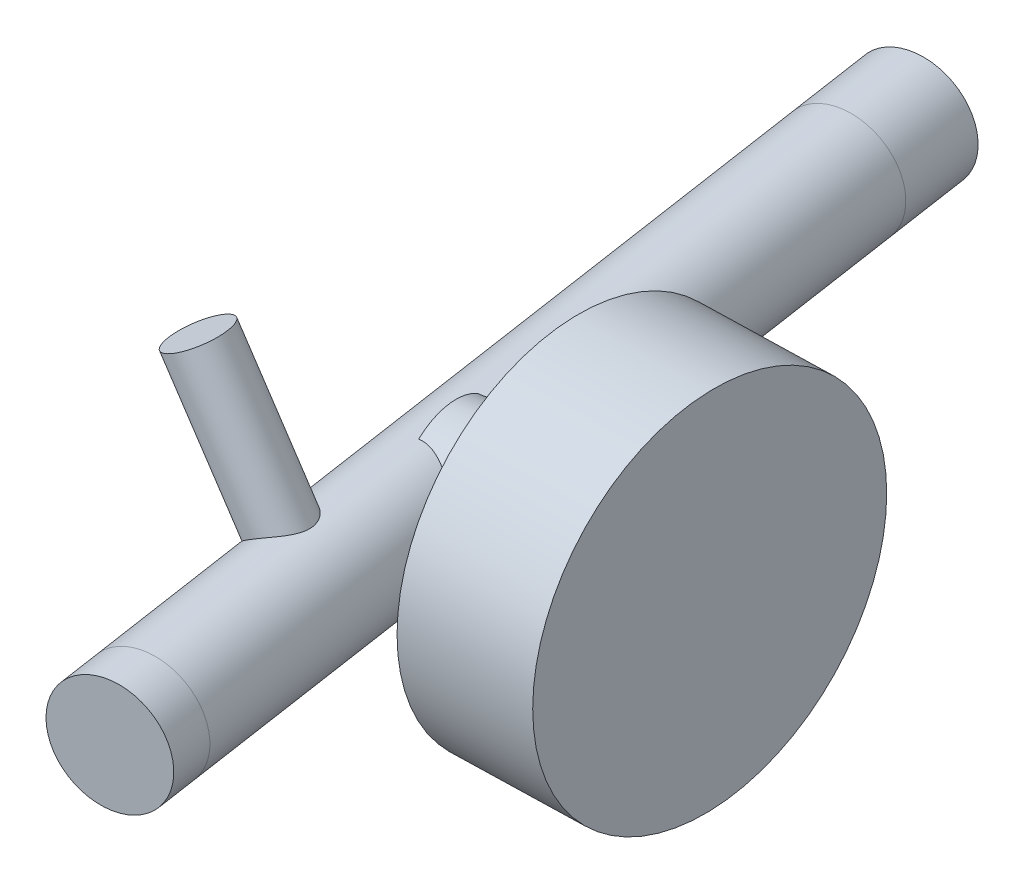
ISO-10303-21;
HEADER;
FILE_DESCRIPTION(('STEP AP214'),'2;1');
FILE_NAME('part.step','',(''),(''),'','','');
FILE_SCHEMA(('AUTOMOTIVE_DESIGN { 1 0 10303 214 1 1 1 1 }'));
ENDSEC;
DATA;
#1=APPLICATION_CONTEXT('core data for automotive mechanical design processes');
#2=APPLICATION_PROTOCOL_DEFINITION('international standard','automotive_design',2000,#1);
#3=PRODUCT_CONTEXT('',#1,'mechanical');
#4=PRODUCT('Part','Part','',(#3));
#5=PRODUCT_RELATED_PRODUCT_CATEGORY('part','',(#4));
#6=PRODUCT_DEFINITION_FORMATION('','',#4);
#7=PRODUCT_DEFINITION_CONTEXT('part definition',#1,'design');
#8=PRODUCT_DEFINITION('design','',#6,#7);
#9=PRODUCT_DEFINITION_SHAPE('','',#8);
#10=(LENGTH_UNIT() NAMED_UNIT(*) SI_UNIT(.MILLI.,.METRE.));
#11=(NAMED_UNIT(*) PLANE_ANGLE_UNIT() SI_UNIT($,.RADIAN.));
#12=(NAMED_UNIT(*) SI_UNIT($,.STERADIAN.) SOLID_ANGLE_UNIT());
#13=UNCERTAINTY_MEASURE_WITH_UNIT(LENGTH_MEASURE(1.E-05),#10,'distance_accuracy_value','');
#14=(GEOMETRIC_REPRESENTATION_CONTEXT(3) GLOBAL_UNCERTAINTY_ASSIGNED_CONTEXT((#13)) GLOBAL_UNIT_ASSIGNED_CONTEXT((#10,
#11,#12)) REPRESENTATION_CONTEXT('',''));
#15=CARTESIAN_POINT('',(0.,0.,0.));
#16=DIRECTION('',(0.,0.,1.));
#17=DIRECTION('',(1.,0.,0.));
#18=AXIS2_PLACEMENT_3D('',#15,#16,#17);
#19=CARTESIAN_POINT('',(542.552954,1419.6,-162.373292));
#20=DIRECTION('',(0.989015863441509,0.,-0.14780941059705));
#21=DIRECTION('',(-0.14780941059705,0.,-0.989015863441509));
#22=AXIS2_PLACEMENT_3D('',#19,#20,#21);
#23=CYLINDRICAL_SURFACE('',#22,20.);
#24=CARTESIAN_POINT('',(542.552954,1419.6,-162.373292));
#25=DIRECTION('',(0.989015863441509,0.,-0.147809410597049));
#26=DIRECTION('',(-0.147809410597049,0.,-0.989015863441509));
#27=AXIS2_PLACEMENT_3D('',#24,#25,#26);
#28=CIRCLE('',#27,20.);
#29=CARTESIAN_POINT('',(544.110222763976,1402.6,-151.953363305583));
#30=VERTEX_POINT('',#29);
#31=CARTESIAN_POINT('',(540.995685228536,1402.6,-172.793220693298));
#32=VERTEX_POINT('',#31);
#33=EDGE_CURVE('E115',#30,#32,#28,.T.);
#34=ORIENTED_EDGE('',*,*,#33,.T.);
#35=CARTESIAN_POINT('',(540.995685236024,1402.6,-172.793220694417));
#36=CARTESIAN_POINT('',(541.140799717402,1402.5999972573,-172.81489763645));
#37=CARTESIAN_POINT('',(541.285433603555,1402.60190013474,-172.839624569867));
#38=CARTESIAN_POINT('',(541.573434028901,1402.60948679116,-172.895031583175));
#39=CARTESIAN_POINT('',(541.716800760971,1402.61516998431,-172.925710740151));
#40=CARTESIAN_POINT('',(542.143956030332,1402.63781085559,-173.026314235167));
#41=CARTESIAN_POINT('',(542.42546599188,1402.66036012705,-173.104905119131));
#42=CARTESIAN_POINT('',(542.975876270462,1402.71931190038,-173.281539593919));
#43=CARTESIAN_POINT('',(543.244904071715,1402.75549549807,-173.379264648698));
#44=CARTESIAN_POINT('',(543.77394754055,1402.84094825915,-173.592140279418));
#45=CARTESIAN_POINT('',(544.03395779421,1402.89022513477,-173.707301108175));
#46=CARTESIAN_POINT('',(544.651192937682,1403.0241930295,-174.003258611011));
#47=CARTESIAN_POINT('',(545.003572632827,1403.11507485298,-174.191356724659));
#48=CARTESIAN_POINT('',(545.689353890084,1403.31924805172,-174.588663111797));
#49=CARTESIAN_POINT('',(546.022747178634,1403.43254910164,-174.797880479816));
#50=CARTESIAN_POINT('',(546.674552284306,1403.68092652329,-175.232704421948));
#51=CARTESIAN_POINT('',(546.992813698709,1403.81617881053,-175.45843454881));
#52=CARTESIAN_POINT('',(547.61278840835,1404.10658038969,-175.919413693505));
#53=CARTESIAN_POINT('',(547.914502259248,1404.26172901293,-176.154662391247));
#54=CARTESIAN_POINT('',(548.648105291446,1404.67257987296,-176.748058236567));
#55=CARTESIAN_POINT('',(549.070717932135,1404.94010815149,-177.109537995157));
#56=CARTESIAN_POINT('',(549.885414223956,1405.51687409363,-177.833886267784));
#57=CARTESIAN_POINT('',(550.277483600929,1405.82613107657,-178.196755348981));
#58=CARTESIAN_POINT('',(551.031346411772,1406.48528835086,-178.914528590849));
#59=CARTESIAN_POINT('',(551.393208933736,1406.83509126735,-179.269449488214));
#60=CARTESIAN_POINT('',(552.087275567161,1407.57596781376,-179.964694122371));
#61=CARTESIAN_POINT('',(552.419491635391,1407.96702466534,-180.305023714975));
#62=CARTESIAN_POINT('',(552.983262593467,1408.70029378965,-180.891812024833));
#63=CARTESIAN_POINT('',(553.220926412971,1409.03444085085,-181.142502896955));
#64=CARTESIAN_POINT('',(553.675844065069,1409.72786276318,-181.62722485398));
#65=CARTESIAN_POINT('',(553.893098586732,1410.08713676525,-181.861256501274));
#66=CARTESIAN_POINT('',(554.305190605022,1410.82989586977,-182.308774281712));
#67=CARTESIAN_POINT('',(554.500052272652,1411.21335416146,-182.522282526453));
#68=CARTESIAN_POINT('',(554.865480934127,1412.00378973354,-182.925250153307));
#69=CARTESIAN_POINT('',(555.036052536744,1412.41076253166,-183.114714096816));
#70=CARTESIAN_POINT('',(555.322437223528,1413.17181508937,-183.434401173977));
#71=CARTESIAN_POINT('',(555.44258943374,1413.52236205531,-183.569161395526));
#72=CARTESIAN_POINT('',(555.663524563173,1414.23670153054,-183.817770332757));
#73=CARTESIAN_POINT('',(555.764311274815,1414.60049142979,-183.931623142626));
#74=CARTESIAN_POINT('',(555.945164577548,1415.33936271231,-184.136428904689));
#75=CARTESIAN_POINT('',(556.025239250538,1415.71443962738,-184.227390788613));
#76=CARTESIAN_POINT('',(556.163522525511,1416.47370699538,-184.384747748264));
#77=CARTESIAN_POINT('',(556.221730880333,1416.85789755127,-184.451142546305));
#78=CARTESIAN_POINT('',(556.315538380175,1417.63444986585,-184.55825269903));
#79=CARTESIAN_POINT('',(556.351030593499,1418.02684142057,-184.598846594995));
#80=CARTESIAN_POINT('',(556.398341764731,1418.81491864625,-184.652976496145));
#81=CARTESIAN_POINT('',(556.410160671915,1419.21060432427,-184.666512443352));
#82=CARTESIAN_POINT('',(556.409908549607,1420.00193137988,-184.666223812691));
#83=CARTESIAN_POINT('',(556.397839001597,1420.39757275871,-184.652400931528));
#84=CARTESIAN_POINT('',(556.350033398823,1421.18552055547,-184.597706030679));
#85=CARTESIAN_POINT('',(556.314298314347,1421.57782710947,-184.556835119964));
#86=CARTESIAN_POINT('',(556.223310150456,1422.32710473388,-184.452947351115));
#87=CARTESIAN_POINT('',(556.169701270584,1422.68453851743,-184.391797856046));
#88=CARTESIAN_POINT('',(556.043519001952,1423.39165055321,-184.248176172043));
#89=CARTESIAN_POINT('',(555.970946765983,1423.74132927547,-184.165705279249));
#90=CARTESIAN_POINT('',(555.807781890001,1424.4310601358,-183.980799383681));
#91=CARTESIAN_POINT('',(555.7171883563,1424.77111179551,-183.878363390828));
#92=CARTESIAN_POINT('',(555.519040660957,1425.44003399637,-183.655083997582));
#93=CARTESIAN_POINT('',(555.411485442212,1425.76890383909,-183.534239449928));
#94=CARTESIAN_POINT('',(555.171373578034,1426.43978285803,-183.265580061784));
#95=CARTESIAN_POINT('',(555.037511996609,1426.78077233587,-183.116387701423));
#96=CARTESIAN_POINT('',(554.752684691415,1427.4471804775,-182.800661170998));
#97=CARTESIAN_POINT('',(554.601718525511,1427.77259873849,-182.634126552664));
#98=CARTESIAN_POINT('',(554.283863995787,1428.40728846778,-182.285756508253));
#99=CARTESIAN_POINT('',(554.116967314961,1428.71655136989,-182.103913095668));
#100=CARTESIAN_POINT('',(553.768426860045,1429.31832526467,-181.727065104611));
#101=CARTESIAN_POINT('',(553.586780129569,1429.61083287889,-181.532057889017));
#102=CARTESIAN_POINT('',(553.116190229106,1430.31968227976,-181.031408999705));
#103=CARTESIAN_POINT('',(552.818700386523,1430.72551995644,-180.718849761276));
#104=CARTESIAN_POINT('',(552.19519927087,1431.49894496176,-180.075201736628));
#105=CARTESIAN_POINT('',(551.869174875182,1431.86651451952,-179.744104450521));
#106=CARTESIAN_POINT('',(551.189253441463,1432.56409746404,-179.069171004765));
#107=CARTESIAN_POINT('',(550.835301802184,1432.89403403304,-178.725310622999));
#108=CARTESIAN_POINT('',(550.100217217311,1433.51551327876,-178.032279246668));
#109=CARTESIAN_POINT('',(549.719093091591,1433.807068327,-177.68311000399));
#110=CARTESIAN_POINT('',(549.018761665479,1434.28922398382,-177.066822432202));
#111=CARTESIAN_POINT('',(548.705349405213,1434.48765734462,-176.799216562056));
#112=CARTESIAN_POINT('',(548.060138787278,1434.86114551334,-176.269683214557));
#113=CARTESIAN_POINT('',(547.728338057418,1435.03619729495,-176.007756475929));
#114=CARTESIAN_POINT('',(547.045414130574,1435.36160017093,-175.495652144994));
#115=CARTESIAN_POINT('',(546.694335290016,1435.51200503708,-175.245449849424));
#116=CARTESIAN_POINT('',(545.97022542962,1435.78697518041,-174.763313662659));
#117=CARTESIAN_POINT('',(545.597208067733,1435.91155632021,-174.53136861131));
#118=CARTESIAN_POINT('',(544.965401203133,1436.09295971655,-174.173096314311));
#119=CARTESIAN_POINT('',(544.713556547671,1436.15806848131,-174.038697173453));
#120=CARTESIAN_POINT('',(544.200011174257,1436.2758704851,-173.784115569016));
#121=CARTESIAN_POINT('',(543.938314352556,1436.3285685736,-173.663927561609));
#122=CARTESIAN_POINT('',(543.406216588738,1436.42053686865,-173.44118097017));
#123=CARTESIAN_POINT('',(543.135847028226,1436.45985057262,-173.338565827751));
#124=CARTESIAN_POINT('',(542.586748598962,1436.52440941633,-173.153529261868));
#125=CARTESIAN_POINT('',(542.308025528213,1436.5496640863,-173.071094180197));
#126=CARTESIAN_POINT('',(541.856442299357,1436.5783357961,-172.957145065278));
#127=CARTESIAN_POINT('',(541.685661893732,1436.58644469591,-172.918430413791));
#128=CARTESIAN_POINT('',(541.342046895883,1436.59728352172,-172.849417142083));
#129=CARTESIAN_POINT('',(541.169210257104,1436.60000754162,-172.81912779391));
#130=CARTESIAN_POINT('',(540.995685236024,1436.6,-172.793220694417));
#131=B_SPLINE_CURVE_WITH_KNOTS('',3,(#35,#36,#37,#38,#39,#40,#41,#42,#43,#44,#45,#46,#47,#48,
#49,#50,#51,#52,#53,#54,#55,#56,#57,#58,#59,#60,#61,#62,#63,#64,#65,#66,#67,#68,#69,#70,#71,#72,
#73,#74,#75,#76,#77,#78,#79,#80,#81,#82,#83,#84,#85,#86,#87,#88,#89,#90,#91,#92,#93,#94,#95,#96,
#97,#98,#99,#100,#101,#102,#103,#104,#105,#106,#107,#108,#109,#110,#111,#112,#113,#114,#115,
#116,#117,#118,#119,#120,#121,#122,#123,#124,#125,#126,#127,#128,#129,#130),.UNSPECIFIED.,.F.,
.F.,(4,2,2,2,2,2,2,2,2,2,2,2,2,2,2,2,2,2,2,2,2,2,2,2,2,2,2,2,2,2,2,2,2,2,2,2,2,2,2,2,2,2,2,2,2,
2,2,4),(0.,0.440081980607926,0.880095779401678,1.75811038662614,2.62259049388785,
3.48758093288357,4.71450333374393,5.94195635339323,7.17978159933149,8.41756525412041,
10.2664756149553,12.1162449298221,13.961660466443,15.8063283289607,17.2469130549873,
18.6874491258521,20.1264153691468,21.56510821968,22.7468833824734,23.9284268771903,
25.1095086322015,26.2906037367943,27.4772184950212,28.6638357958308,29.8503795088296,
31.0368745764645,32.1353690064713,33.2337966740183,34.3322788269716,35.4308294677122,
36.6163134073203,37.8018279974559,38.9879649423625,40.1743402169242,41.9489029453851,
43.7242861007541,45.5032307190019,47.2816005184909,48.6529216495624,50.0244201005837,
51.3928853481092,52.7605074871563,53.638243458844,54.5156358840483,55.3901490601416,
56.2640687042674,56.7896992629492,57.3159060098977),.UNSPECIFIED.);
#132=CARTESIAN_POINT('',(540.995685228536,1436.6,-172.793220693298));
#133=VERTEX_POINT('',#132);
#134=EDGE_CURVE('E88',#32,#133,#131,.T.);
#135=ORIENTED_EDGE('',*,*,#134,.T.);
#136=CARTESIAN_POINT('',(544.110222763976,1436.6,-151.953363305583));
#137=VERTEX_POINT('',#136);
#138=EDGE_CURVE('E117',#133,#137,#28,.T.);
#139=ORIENTED_EDGE('',*,*,#138,.T.);
#140=CARTESIAN_POINT('',(544.110222763976,1436.6,-151.953363305583));
#141=CARTESIAN_POINT('',(544.255334157068,1436.6000027427,-151.975060910947));
#142=CARTESIAN_POINT('',(544.400877685838,1436.59809986526,-151.993701282605));
#143=CARTESIAN_POINT('',(544.692493305027,1436.59051320886,-152.024918467252));
#144=CARTESIAN_POINT('',(544.838565310062,1436.58483001572,-152.037496219221));
#145=CARTESIAN_POINT('',(545.276469540674,1436.56218914447,-152.066176732284));
#146=CARTESIAN_POINT('',(545.568656606228,1436.53963987305,-152.07332544323));
#147=CARTESIAN_POINT('',(546.146659495367,1436.4806880998,-152.065333445798));
#148=CARTESIAN_POINT('',(546.432504101793,1436.44450450215,-152.050534627734));
#149=CARTESIAN_POINT('',(547.000669697661,1436.35905174118,-152.001637989972));
#150=CARTESIAN_POINT('',(547.282988507379,1436.30977486561,-151.967528782581));
#151=CARTESIAN_POINT('',(547.959783009248,1436.17580697109,-151.8649653056));
#152=CARTESIAN_POINT('',(548.351759953029,1436.08492514778,-151.788112036831));
#153=CARTESIAN_POINT('',(549.123736975125,1435.88075194943,-151.608669083974));
#154=CARTESIAN_POINT('',(549.503731800376,1435.76745089972,-151.506068283788));
#155=CARTESIAN_POINT('',(550.25418633861,1435.51907347854,-151.280813449367));
#156=CARTESIAN_POINT('',(550.624538344085,1435.38382119157,-151.157997287551));
#157=CARTESIAN_POINT('',(551.352200364359,1435.09341961296,-150.898423801418));
#158=CARTESIAN_POINT('',(551.709510816953,1434.93827099002,-150.761666945665));
#159=CARTESIAN_POINT('',(552.584551038931,1434.52742013065,-150.408684445139));
#160=CARTESIAN_POINT('',(553.094383969562,1434.25989185249,-150.186559610606));
#161=CARTESIAN_POINT('',(554.08526084572,1433.68312591112,-149.732056055383));
#162=CARTESIAN_POINT('',(554.566291306622,1433.37386892859,-149.499672618955));
#163=CARTESIAN_POINT('',(555.497070482698,1432.71471165519,-149.033670808377));
#164=CARTESIAN_POINT('',(555.946890160481,1432.36490873918,-148.800056628253));
#165=CARTESIAN_POINT('',(556.813899240366,1431.62403219379,-148.338116322045));
#166=CARTESIAN_POINT('',(557.231101788859,1431.23297534276,-148.109788091841));
#167=CARTESIAN_POINT('',(557.941798935157,1430.49970621894,-147.713470315435));
#168=CARTESIAN_POINT('',(558.242372893723,1430.16555915762,-147.543219617593));
#169=CARTESIAN_POINT('',(558.819131792904,1429.47213724501,-147.21268275303));
#170=CARTESIAN_POINT('',(559.095317556905,1429.11286324279,-147.052396249955));
#171=CARTESIAN_POINT('',(559.620244650246,1428.37010413793,-146.74491691292));
#172=CARTESIAN_POINT('',(559.869015559238,1427.98664584605,-146.597710000453));
#173=CARTESIAN_POINT('',(560.336293058173,1427.19621027357,-146.31919114209));
#174=CARTESIAN_POINT('',(560.55480538913,1426.78923747525,-146.187876181583));
#175=CARTESIAN_POINT('',(560.922143882865,1426.02818491712,-145.965888687535));
#176=CARTESIAN_POINT('',(561.076446088637,1425.67763795098,-145.872145952931));
#177=CARTESIAN_POINT('',(561.360413622474,1424.96329847533,-145.698995223656));
#178=CARTESIAN_POINT('',(561.490083774275,1424.59950857586,-145.619584422493));
#179=CARTESIAN_POINT('',(561.722914057632,1423.8606372929,-145.476604086059));
#180=CARTESIAN_POINT('',(561.826084529332,1423.48556037761,-145.413028372249));
#181=CARTESIAN_POINT('',(562.004332205453,1422.72629300914,-145.302977279747));
#182=CARTESIAN_POINT('',(562.079409092326,1422.34210245301,-145.256502094345));
#183=CARTESIAN_POINT('',(562.200433628591,1421.56555013794,-145.181498804199));
#184=CARTESIAN_POINT('',(562.246243507601,1421.17315858297,-145.153055587205));
#185=CARTESIAN_POINT('',(562.30731345724,1420.38508135679,-145.115123352875));
#186=CARTESIAN_POINT('',(562.322573462409,1419.98939567851,-145.105634376154));
#187=CARTESIAN_POINT('',(562.322247969338,1419.19806862237,-145.105836681518));
#188=CARTESIAN_POINT('',(562.306664383917,1418.80242724328,-145.11552677418));
#189=CARTESIAN_POINT('',(562.244956417377,1418.01447944598,-145.153854762458));
#190=CARTESIAN_POINT('',(562.198833288382,1417.62217289171,-145.182491881243));
#191=CARTESIAN_POINT('',(562.081447030605,1416.87289526676,-145.255237884263));
#192=CARTESIAN_POINT('',(562.012302221787,1416.51546148294,-145.298041717735));
#193=CARTESIAN_POINT('',(561.849642601755,1415.80834944663,-145.398495692495));
#194=CARTESIAN_POINT('',(561.756129271916,1415.45867072411,-145.45614493132));
#195=CARTESIAN_POINT('',(561.546032673278,1414.76893986325,-145.585266526096));
#196=CARTESIAN_POINT('',(561.429448260369,1414.42888820328,-145.656739567573));
#197=CARTESIAN_POINT('',(561.174678100264,1413.7599660019,-145.812329934249));
#198=CARTESIAN_POINT('',(561.036491006729,1413.43109615893,-145.89644804751));
#199=CARTESIAN_POINT('',(560.72832248595,1412.76021713954,-146.083166383648));
#200=CARTESIAN_POINT('',(560.556690394383,1412.41922766151,-146.18670240897));
#201=CARTESIAN_POINT('',(560.191999184114,1411.7528195195,-146.405357747496));
#202=CARTESIAN_POINT('',(559.998939511535,1411.42740125832,-146.520477360117));
#203=CARTESIAN_POINT('',(559.593120169536,1410.79271152867,-146.760693620464));
#204=CARTESIAN_POINT('',(559.380350211495,1410.48344862638,-146.885795474069));
#205=CARTESIAN_POINT('',(558.936859627473,1409.88167473128,-147.144273634045));
#206=CARTESIAN_POINT('',(558.706135403268,1409.58916711689,-147.277651597946));
#207=CARTESIAN_POINT('',(558.109732474714,1408.88031771605,-147.618837341348));
#208=CARTESIAN_POINT('',(557.733858046556,1408.47448003954,-147.830761615648));
#209=CARTESIAN_POINT('',(556.949416495168,1407.70105503451,-148.263991199703));
#210=CARTESIAN_POINT('',(556.540834337588,1407.33348547689,-148.48530080126));
#211=CARTESIAN_POINT('',(555.693290795832,1406.63590253263,-148.931953077792));
#212=CARTESIAN_POINT('',(555.25427011436,1406.30596596375,-149.157302952634));
#213=CARTESIAN_POINT('',(554.348682465983,1405.68448671827,-149.605134221745));
#214=CARTESIAN_POINT('',(553.882124445767,1405.39293167015,-149.827616519359));
#215=CARTESIAN_POINT('',(553.032209125721,1404.91077601383,-150.212218163117));
#216=CARTESIAN_POINT('',(552.65425110715,1404.71234265339,-150.376498052843));
#217=CARTESIAN_POINT('',(551.882412559016,1404.33885448532,-150.694251983649));
#218=CARTESIAN_POINT('',(551.488529976898,1404.163802704,-150.847724624723));
#219=CARTESIAN_POINT('',(550.685721763402,1403.83839982855,-151.137784799758));
#220=CARTESIAN_POINT('',(550.276831327748,1403.68799496262,-151.274408926131));
#221=CARTESIAN_POINT('',(549.443398647524,1403.41302481969,-151.523768820885));
#222=CARTESIAN_POINT('',(549.018866201203,1403.28844368006,-151.636519254971));
#223=CARTESIAN_POINT('',(548.309917610756,1403.10704028384,-151.794414307194));
#224=CARTESIAN_POINT('',(548.02978286332,1403.04193151906,-151.849308593889));
#225=CARTESIAN_POINT('',(547.464244523164,1402.92412951526,-151.942620057405));
#226=CARTESIAN_POINT('',(547.178843035589,1402.87143142675,-151.981043674969));
#227=CARTESIAN_POINT('',(546.604870613224,1402.77946313166,-152.03848697017));
#228=CARTESIAN_POINT('',(546.316313152741,1402.74014942767,-152.057569909956));
#229=CARTESIAN_POINT('',(545.737108257555,1402.67559058391,-152.07398041487));
#230=CARTESIAN_POINT('',(545.446462374236,1402.65033591392,-152.071322736579));
#231=CARTESIAN_POINT('',(544.981295687498,1402.62166420401,-152.048262659284));
#232=CARTESIAN_POINT('',(544.80665850425,1402.61355530416,-152.035354306491));
#233=CARTESIAN_POINT('',(544.457880318742,1402.60271647829,-152.000888724093));
#234=CARTESIAN_POINT('',(544.283740070236,1402.59999245838,-151.979322029231));
#235=CARTESIAN_POINT('',(544.110222763976,1402.6,-151.953363305583));
#236=B_SPLINE_CURVE_WITH_KNOTS('',3,(#140,#141,#142,#143,#144,#145,#146,#147,#148,#149,#150,
#151,#152,#153,#154,#155,#156,#157,#158,#159,#160,#161,#162,#163,#164,#165,#166,#167,#168,#169,
#170,#171,#172,#173,#174,#175,#176,#177,#178,#179,#180,#181,#182,#183,#184,#185,#186,#187,#188,
#189,#190,#191,#192,#193,#194,#195,#196,#197,#198,#199,#200,#201,#202,#203,#204,#205,#206,#207,
#208,#209,#210,#211,#212,#213,#214,#215,#216,#217,#218,#219,#220,#221,#222,#223,#224,#225,#226,
#227,#228,#229,#230,#231,#232,#233,#234,#235),.UNSPECIFIED.,.F.,.F.,(4,2,2,2,2,2,2,2,2,2,2,2,2,
2,2,2,2,2,2,2,2,2,2,2,2,2,2,2,2,2,2,2,2,2,2,2,2,2,2,2,2,2,2,2,2,2,2,4),(0.,0.440081980221863,
0.880095778630183,1.75811038509224,2.62259049160744,3.48758092985339,4.71450332865346,
5.94195634624074,7.17978159008018,8.41756524277089,10.2664756015107,12.1162449142823,
13.9616604488472,15.8063283093133,17.2469130362688,18.687449108064,20.1264153522836,
21.5651082037415,22.7468833673204,23.9284268628228,25.1095086186204,26.2906037239996,
27.4772184830118,28.6638357846067,29.8503794983904,31.03687456681,32.1353689975889,
33.2337966659083,34.3322788196332,35.4308294611452,36.6163134013437,37.8018279920694,
38.9879649375685,40.1743402127226,41.9489029403791,43.7242860949419,45.5032307123635,
47.2816005110256,48.6529216395019,50.0244200879254,51.3928853328608,52.7605074693228,
53.6382434404235,54.5156358650412,55.3901490405579,56.2640686841088,56.7896992441561,
57.3159059924721),.UNSPECIFIED.);
#237=EDGE_CURVE('E107',#137,#30,#236,.T.);
#238=ORIENTED_EDGE('',*,*,#237,.T.);
#239=EDGE_LOOP('',(#34,#135,#139,#238));
#240=FACE_BOUND('',#239,.T.);
#241=CARTESIAN_POINT('',(573.655585503097,1419.6,-167.021611405609));
#242=DIRECTION('',(0.999657324931295,0.,-0.0261769499982011));
#243=DIRECTION('',(-0.0261769499982011,0.,-0.999657324931295));
#244=AXIS2_PLACEMENT_3D('',#241,#242,#243);
#245=ELLIPSE('',#244,20.1501965036612,20.);
#246=CARTESIAN_POINT('',(573.128114816766,1419.6,-187.164902939298));
#247=VERTEX_POINT('',#246);
#248=EDGE_CURVE('E83',#247,#247,#245,.F.);
#249=ORIENTED_EDGE('',*,*,#248,.T.);
#250=EDGE_LOOP('',(#249));
#251=FACE_BOUND('',#250,.T.);
#252=ADVANCED_FACE('F79',(#240,#251),#23,.T.);
#253=CARTESIAN_POINT('',(517.770606,1419.6,-328.195852));
#254=DIRECTION('',(-0.147809419708946,0.,-0.989015862079727));
#255=DIRECTION('',(-0.989015862079727,0.,0.147809419708946));
#256=AXIS2_PLACEMENT_3D('',#253,#254,#255);
#257=PLANE('',#256);
#258=CARTESIAN_POINT('',(517.770606,1419.6,-328.195852));
#259=DIRECTION('',(-0.147809419708946,0.,-0.989015862079727));
#260=DIRECTION('',(-0.989015862079727,0.,0.147809419708946));
#261=AXIS2_PLACEMENT_3D('',#258,#259,#260);
#262=CIRCLE('',#261,17.);
#263=CARTESIAN_POINT('',(500.957336344644,1419.6,-325.683091864948));
#264=VERTEX_POINT('',#263);
#265=EDGE_CURVE('E118',#264,#264,#262,.T.);
#266=ORIENTED_EDGE('',*,*,#265,.T.);
#267=EDGE_LOOP('',(#266));
#268=FACE_BOUND('',#267,.T.);
#269=ADVANCED_FACE('F81',(#268),#257,.T.);
#270=CARTESIAN_POINT('',(521.613651,1419.6,-302.481439));
#271=DIRECTION('',(-0.147809419708946,0.,-0.989015862079727));
#272=DIRECTION('',(-0.989015862079727,0.,0.147809419708946));
#273=AXIS2_PLACEMENT_3D('',#270,#271,#272);
#274=CYLINDRICAL_SURFACE('',#273,17.);
#275=ORIENTED_EDGE('',*,*,#265,.F.);
#276=EDGE_LOOP('',(#275));
#277=FACE_BOUND('',#276,.T.);
#278=CARTESIAN_POINT('',(521.613651434475,1419.6,-302.481439064933));
#279=DIRECTION('',(-0.147809419708946,0.,-0.989015862079727));
#280=DIRECTION('',(-0.989015862079727,0.,0.147809419708946));
#281=AXIS2_PLACEMENT_3D('',#278,#279,#280);
#282=CIRCLE('',#281,17.0000000000001);
#283=CARTESIAN_POINT('',(504.80038177912,1419.6,-299.968678929881));
#284=VERTEX_POINT('',#283);
#285=EDGE_CURVE('E133',#284,#284,#282,.T.);
#286=ORIENTED_EDGE('',*,*,#285,.T.);
#287=EDGE_LOOP('',(#286));
#288=FACE_BOUND('',#287,.T.);
#289=ADVANCED_FACE('F154',(#277,#288),#274,.T.);
#290=CARTESIAN_POINT('',(558.6,1419.6,-55.));
#291=DIRECTION('',(-0.147809409886339,0.,-0.989015863547725));
#292=DIRECTION('',(-0.989015863547725,0.,0.147809409886339));
#293=AXIS2_PLACEMENT_3D('',#290,#291,#292);
#294=CYLINDRICAL_SURFACE('',#293,17.0000000000001);
#295=CARTESIAN_POINT('',(535.21300630447,1428.09675205195,-111.869188380155));
#296=CARTESIAN_POINT('',(535.228773052007,1428.06720010154,-111.648335076506));
#297=CARTESIAN_POINT('',(535.249540795603,1428.0458571408,-111.426780557914));
#298=CARTESIAN_POINT('',(535.300869094514,1428.02009605861,-110.983753651861));
#299=CARTESIAN_POINT('',(535.33143132241,1428.01568082954,-110.762281284901));
#300=CARTESIAN_POINT('',(535.402121288975,1428.02391545074,-110.321048698894));
#301=CARTESIAN_POINT('',(535.442255223162,1428.03657637877,-110.101289684393));
#302=CARTESIAN_POINT('',(535.531807850397,1428.0786441817,-109.665309371466));
#303=CARTESIAN_POINT('',(535.581226244823,1428.10805051806,-109.449087959501));
#304=CARTESIAN_POINT('',(535.688899225951,1428.18273830729,-109.022454624927));
#305=CARTESIAN_POINT('',(535.747123626608,1428.22796619555,-108.81202565271));
#306=CARTESIAN_POINT('',(535.872287684527,1428.33325637075,-108.397582985293));
#307=CARTESIAN_POINT('',(535.939227479364,1428.39331889187,-108.193569391423));
#308=CARTESIAN_POINT('',(536.081629290572,1428.52700898986,-107.793091209486));
#309=CARTESIAN_POINT('',(536.157092295827,1428.60063814138,-107.596627500926));
#310=CARTESIAN_POINT('',(536.316416302456,1428.7600906649,-107.212156605341));
#311=CARTESIAN_POINT('',(536.40028063244,1428.84591887585,-107.024152813234));
#312=CARTESIAN_POINT('',(536.581313926934,1429.03351679794,-106.64701066122));
#313=CARTESIAN_POINT('',(536.678968944511,1429.1359165887,-106.458419346187));
#314=CARTESIAN_POINT('',(536.883512754065,1429.35106293234,-106.092399682944));
#315=CARTESIAN_POINT('',(536.990404584458,1429.46381289065,-105.914975041397));
#316=CARTESIAN_POINT('',(537.2134255218,1429.69803745702,-105.572004550874));
#317=CARTESIAN_POINT('',(537.329557289522,1429.81951457723,-105.406462149858));
#318=CARTESIAN_POINT('',(537.571056810225,1430.06960378159,-105.087970157157));
#319=CARTESIAN_POINT('',(537.696425308281,1430.19821644113,-104.935021583458));
#320=CARTESIAN_POINT('',(537.974105930826,1430.47894880886,-104.622483285505));
#321=CARTESIAN_POINT('',(538.127763778322,1430.63188698558,-104.464818297062));
#322=CARTESIAN_POINT('',(538.446951179813,1430.94282466232,-104.167681230298));
#323=CARTESIAN_POINT('',(538.612477151025,1431.10082262697,-104.028203697036));
#324=CARTESIAN_POINT('',(538.955418232822,1431.41991896543,-103.768385470646));
#325=CARTESIAN_POINT('',(539.132840316005,1431.58101911738,-103.648056142595));
#326=CARTESIAN_POINT('',(539.499084011834,1431.90404280972,-103.42783143971));
#327=CARTESIAN_POINT('',(539.687900008659,1432.06596590904,-103.327926103158));
#328=CARTESIAN_POINT('',(540.075357608112,1432.38769059408,-103.150132784691));
#329=CARTESIAN_POINT('',(540.273938175934,1432.54749898469,-103.072124480873));
#330=CARTESIAN_POINT('',(540.681037106899,1432.86382446809,-102.938471410504));
#331=CARTESIAN_POINT('',(540.889555593282,1433.02034152002,-102.882826921366));
#332=CARTESIAN_POINT('',(541.315126060014,1433.32787844174,-102.794889943913));
#333=CARTESIAN_POINT('',(541.532170480271,1433.47890296276,-102.762577238665));
#334=CARTESIAN_POINT('',(541.973368369817,1433.77360790837,-102.721937761094));
#335=CARTESIAN_POINT('',(542.197520906441,1433.91728929006,-102.713607855014));
#336=CARTESIAN_POINT('',(542.625960256376,1434.18014315003,-102.720867855691));
#337=CARTESIAN_POINT('',(542.829708310424,1434.30027021708,-102.733918594898));
#338=CARTESIAN_POINT('',(543.23977133498,1434.53220262839,-102.779276922277));
#339=CARTESIAN_POINT('',(543.446086094374,1434.64400865185,-102.811582936799));
#340=CARTESIAN_POINT('',(543.859601720362,1434.85840495185,-102.895177777705));
#341=CARTESIAN_POINT('',(544.066802425073,1434.96099684246,-102.946463271276));
#342=CARTESIAN_POINT('',(544.480432519334,1435.15636062322,-103.067500470189));
#343=CARTESIAN_POINT('',(544.686861912796,1435.24913256322,-103.137252081765));
#344=CARTESIAN_POINT('',(545.086850980944,1435.42004370844,-103.290494105993));
#345=CARTESIAN_POINT('',(545.280532502922,1435.49868633873,-103.373108606866));
#346=CARTESIAN_POINT('',(545.66437353015,1435.64673196106,-103.553579193359));
#347=CARTESIAN_POINT('',(545.854531805228,1435.71613177635,-103.651440494348));
#348=CARTESIAN_POINT('',(546.229910125449,1435.84574589409,-103.861502694434));
#349=CARTESIAN_POINT('',(546.415131450529,1435.90596259683,-103.973699832296));
#350=CARTESIAN_POINT('',(546.779559162268,1436.01753097186,-104.211602248133));
#351=CARTESIAN_POINT('',(546.958763177897,1436.06887918193,-104.337312770753));
#352=CARTESIAN_POINT('',(547.321630901277,1436.16622885765,-104.610065483676));
#353=CARTESIAN_POINT('',(547.504802535684,1436.21165010719,-104.757969385251));
#354=CARTESIAN_POINT('',(547.861789501006,1436.29352676956,-105.067060216993));
#355=CARTESIAN_POINT('',(548.035601592733,1436.32997909376,-105.228251697549));
#356=CARTESIAN_POINT('',(548.372715414536,1436.39468395797,-105.562934582831));
#357=CARTESIAN_POINT('',(548.536012899906,1436.42293320237,-105.736430896307));
#358=CARTESIAN_POINT('',(548.850908730795,1436.47207326808,-106.094721470283));
#359=CARTESIAN_POINT('',(549.002506282212,1436.49296359027,-106.279516496129));
#360=CARTESIAN_POINT('',(549.308730237154,1436.53023725583,-106.680242303103));
#361=CARTESIAN_POINT('',(549.461883340785,1436.54588044221,-106.897370625672));
#362=CARTESIAN_POINT('',(549.750812160737,1436.57057697652,-107.343158773496));
#363=CARTESIAN_POINT('',(549.886593088341,1436.57963230451,-107.571815111763));
#364=CARTESIAN_POINT('',(550.139264785809,1436.5925477345,-108.03965233936));
#365=CARTESIAN_POINT('',(550.25614555139,1436.59640509297,-108.278838717816));
#366=CARTESIAN_POINT('',(550.469205466133,1436.60032679373,-108.766348361618));
#367=CARTESIAN_POINT('',(550.565382145959,1436.60039068382,-109.014672712701));
#368=CARTESIAN_POINT('',(550.735939115323,1436.5981169566,-109.521069148192));
#369=CARTESIAN_POINT('',(550.810127576088,1436.59575896178,-109.779206055006));
#370=CARTESIAN_POINT('',(550.933751987338,1436.58998239422,-110.30121149609));
#371=CARTESIAN_POINT('',(550.98320201137,1436.58656442627,-110.565076682219));
#372=CARTESIAN_POINT('',(551.05575246079,1436.57988557511,-111.096097337598));
#373=CARTESIAN_POINT('',(551.078886306843,1436.5766244977,-111.363248197097));
#374=CARTESIAN_POINT('',(551.097715627287,1436.57120540648,-111.898518160532));
#375=CARTESIAN_POINT('',(551.093416460875,1436.56904717731,-112.166637065128));
#376=CARTESIAN_POINT('',(551.059384771842,1436.56658627974,-112.663956824455));
#377=CARTESIAN_POINT('',(551.033254023614,1436.56606816768,-112.893408967711));
#378=CARTESIAN_POINT('',(550.960353709892,1436.56636913682,-113.348996536336));
#379=CARTESIAN_POINT('',(550.913586208721,1436.56718808429,-113.575132291111));
#380=CARTESIAN_POINT('',(550.799951456969,1436.57000517204,-114.022305451044));
#381=CARTESIAN_POINT('',(550.733081697271,1436.57200345955,-114.243342216049));
#382=CARTESIAN_POINT('',(550.580175113848,1436.57677739914,-114.678663006476));
#383=CARTESIAN_POINT('',(550.494138027668,1436.57955306187,-114.892946939387));
#384=CARTESIAN_POINT('',(550.309598776147,1436.58511310873,-115.301234182379));
#385=CARTESIAN_POINT('',(550.212103268884,1436.58788773424,-115.495694075903));
#386=CARTESIAN_POINT('',(550.002312852936,1436.59296356449,-115.876499530664));
#387=CARTESIAN_POINT('',(549.890013017652,1436.59526461097,-116.06284236311));
#388=CARTESIAN_POINT('',(549.532762492391,1436.60040908095,-116.608430961159));
#389=CARTESIAN_POINT('',(549.267349131382,1436.60149876856,-116.954479504943));
#390=CARTESIAN_POINT('',(548.656895417138,1436.59235739679,-117.645991747484));
#391=CARTESIAN_POINT('',(548.306114550992,1436.58074686095,-117.986363857341));
#392=CARTESIAN_POINT('',(547.747035920873,1436.54673964536,-118.456057681891));
#393=CARTESIAN_POINT('',(547.555049292569,1436.53262333412,-118.605899998817));
#394=CARTESIAN_POINT('',(547.161351603507,1436.49782119794,-118.891533438332));
#395=CARTESIAN_POINT('',(546.959639039298,1436.47713435453,-119.027322378253));
#396=CARTESIAN_POINT('',(546.524587790469,1436.42543364268,-119.298805589036));
#397=CARTESIAN_POINT('',(546.290257297139,1436.39351445075,-119.432741498593));
#398=CARTESIAN_POINT('',(545.813395114391,1436.31907919756,-119.681534086899));
#399=CARTESIAN_POINT('',(545.57086648025,1436.27656704726,-119.796397781141));
#400=CARTESIAN_POINT('',(545.079569077133,1436.17983507189,-120.0061909716));
#401=CARTESIAN_POINT('',(544.830800109639,1436.12561487395,-120.101119832745));
#402=CARTESIAN_POINT('',(544.329255457558,1436.00456752824,-120.270073347181));
#403=CARTESIAN_POINT('',(544.076480103427,1435.93774141532,-120.344099715178));
#404=CARTESIAN_POINT('',(543.579639345459,1435.79384027228,-120.467752922713));
#405=CARTESIAN_POINT('',(543.33563818466,1435.7172930939,-120.518250227252));
#406=CARTESIAN_POINT('',(542.848418094533,1435.55174805271,-120.598430328431));
#407=CARTESIAN_POINT('',(542.605199153298,1435.46275038037,-120.628113443437));
#408=CARTESIAN_POINT('',(542.122127995031,1435.27245862156,-120.666098146924));
#409=CARTESIAN_POINT('',(541.882273298105,1435.17117418803,-120.674416407962));
#410=CARTESIAN_POINT('',(541.408176837014,1434.95671661096,-120.669418201082));
#411=CARTESIAN_POINT('',(541.173934458166,1434.84354477677,-120.656104113521));
#412=CARTESIAN_POINT('',(540.738809591485,1434.61925746941,-120.610524155791));
#413=CARTESIAN_POINT('',(540.537095507473,1434.50928976732,-120.58050847684));
#414=CARTESIAN_POINT('',(540.141510197361,1434.28146151642,-120.503600880954));
#415=CARTESIAN_POINT('',(539.947638302658,1434.16360164275,-120.456710406103));
#416=CARTESIAN_POINT('',(539.56910572116,1433.92102413973,-120.346483898698));
#417=CARTESIAN_POINT('',(539.384444498569,1433.79630691018,-120.283148824083));
#418=CARTESIAN_POINT('',(539.025460170916,1433.54118721844,-120.14062950536));
#419=CARTESIAN_POINT('',(538.851137244065,1433.41078465833,-120.061444988145));
#420=CARTESIAN_POINT('',(538.517764797465,1433.14874970023,-119.890028806808));
#421=CARTESIAN_POINT('',(538.358450155936,1433.01722082032,-119.79815338283));
#422=CARTESIAN_POINT('',(538.051095816687,1432.75117837874,-119.600716348763));
#423=CARTESIAN_POINT('',(537.903060119408,1432.61666377973,-119.495149918259));
#424=CARTESIAN_POINT('',(537.61877078843,1432.34600279926,-119.271169416472));
#425=CARTESIAN_POINT('',(537.482514252298,1432.20985682924,-119.152758526422));
#426=CARTESIAN_POINT('',(537.221927230578,1431.93713361452,-118.903812513493));
#427=CARTESIAN_POINT('',(537.097601090568,1431.80055623125,-118.773273006655));
#428=CARTESIAN_POINT('',(536.850958357194,1431.51671238715,-118.489270954692));
#429=CARTESIAN_POINT('',(536.729707716693,1431.36952244135,-118.334803200113));
#430=CARTESIAN_POINT('',(536.501334143114,1431.07777713006,-118.013402509888));
#431=CARTESIAN_POINT('',(536.394217609993,1430.93322298342,-117.846463980664));
#432=CARTESIAN_POINT('',(536.093735144272,1430.50569004681,-117.327832267193));
#433=CARTESIAN_POINT('',(535.921276164676,1430.22888764388,-116.95836935745));
#434=CARTESIAN_POINT('',(535.696203151297,1429.82363852354,-116.354390687656));
#435=CARTESIAN_POINT('',(535.62454701246,1429.68438481144,-116.133769844924));
#436=CARTESIAN_POINT('',(535.497342375769,1429.41742439889,-115.681020650604));
#437=CARTESIAN_POINT('',(535.441796671844,1429.28971970395,-115.448890311161));
#438=CARTESIAN_POINT('',(535.346655451338,1429.0486316717,-114.974684199303));
#439=CARTESIAN_POINT('',(535.30703204526,1428.93522353387,-114.732626642536));
#440=CARTESIAN_POINT('',(535.24333221644,1428.72505140074,-114.239519484184));
#441=CARTESIAN_POINT('',(535.21924876282,1428.62827989293,-113.988474003427));
#442=CARTESIAN_POINT('',(535.183289014966,1428.43758275431,-113.431256320498));
#443=CARTESIAN_POINT('',(535.174524354523,1428.34754888951,-113.123530047262));
#444=CARTESIAN_POINT('',(535.178087098868,1428.19831076501,-112.500744624761));
#445=CARTESIAN_POINT('',(535.190411457503,1428.13910205443,-112.185686541006));
#446=CARTESIAN_POINT('',(535.21300630447,1428.09675205195,-111.869188380155));
#447=B_SPLINE_CURVE_WITH_KNOTS('',3,(#295,#296,#297,#298,#299,#300,#301,#302,#303,#304,#305,
#306,#307,#308,#309,#310,#311,#312,#313,#314,#315,#316,#317,#318,#319,#320,#321,#322,#323,#324,
#325,#326,#327,#328,#329,#330,#331,#332,#333,#334,#335,#336,#337,#338,#339,#340,#341,#342,#343,
#344,#345,#346,#347,#348,#349,#350,#351,#352,#353,#354,#355,#356,#357,#358,#359,#360,#361,#362,
#363,#364,#365,#366,#367,#368,#369,#370,#371,#372,#373,#374,#375,#376,#377,#378,#379,#380,#381,
#382,#383,#384,#385,#386,#387,#388,#389,#390,#391,#392,#393,#394,#395,#396,#397,#398,#399,#400,
#401,#402,#403,#404,#405,#406,#407,#408,#409,#410,#411,#412,#413,#414,#415,#416,#417,#418,#419,
#420,#421,#422,#423,#424,#425,#426,#427,#428,#429,#430,#431,#432,#433,#434,#435,#436,#437,#438,
#439,#440,#441,#442,#443,#444,#445,#446),.UNSPECIFIED.,.T.,.F.,(4,2,2,2,2,2,2,2,2,2,2,2,2,2,2,2,
2,2,2,2,2,2,2,2,2,2,2,2,2,2,2,2,2,2,2,2,2,2,2,2,2,2,2,2,2,2,2,2,2,2,2,2,2,2,2,2,2,2,2,2,2,2,2,2,
2,2,2,2,2,2,2,2,2,2,2,4),(0.,0.669852148359501,1.33981874672117,2.01022017959404,
2.68060005354324,3.34873194636605,4.0168743870594,4.68509442702079,5.35358027122725,
6.06019913793948,6.76705133569078,7.47410782365921,8.181221408559,8.98448212091868,
9.78750135540376,10.590995444199,11.3940966921083,12.1926945107556,12.9913022353678,
13.7892171351849,14.5870277692415,15.2967620444927,16.0064383241442,16.7159900431028,
17.4255381592339,18.0991101830755,18.7729131190448,19.4465396336595,20.1204285381212,
20.8389971717704,21.5578129128895,22.2769170408984,22.9960699332314,23.7936659103572,
24.591022061829,25.3887989001032,26.1866708350191,26.9913114239684,27.795493735767,
28.5986536187877,29.4016566047123,30.0935405888656,30.7853553786215,31.4772565550027,
32.1691672060923,32.8211243197096,33.4732989425758,34.7768550876648,36.237433917612,
36.9687239022267,37.7001272954816,38.5145059161963,39.328584310379,40.1426886350048,
40.956726156279,41.7376311040741,42.5185241071735,43.2988075369284,44.0790051124564,
44.7732242748289,45.4673841247657,46.1615035472386,46.8556349314134,47.5332103020342,
48.2110248885419,48.8886719798752,49.5665649706393,50.3019875654394,51.037742026817,
52.5094798041548,53.3203916516166,54.1314440463343,54.9410695434508,55.7503284772208,
56.7104119090442,57.6703566755204),.UNSPECIFIED.);
#448=CARTESIAN_POINT('',(535.21300630447,1428.09675205195,-111.869188380155));
#449=VERTEX_POINT('',#448);
#450=EDGE_CURVE('E12',#449,#449,#447,.T.);
#451=ORIENTED_EDGE('',*,*,#450,.F.);
#452=EDGE_LOOP('',(#451));
#453=FACE_BOUND('',#452,.T.);
#454=ORIENTED_EDGE('',*,*,#134,.F.);
#455=CARTESIAN_POINT('',(539.596735897859,1402.6,-182.15380926883));
#456=CARTESIAN_POINT('',(541.271909217959,1402.6,-170.944962816493));
#457=CARTESIAN_POINT('',(542.947082538059,1402.6,-159.736116364156));
#458=CARTESIAN_POINT('',(544.917894606153,1402.6,-146.549104851602));
#459=CARTESIAN_POINT('',(545.213533354147,1402.6,-144.570939791386));
#460=CARTESIAN_POINT('',(545.509172102141,1402.6,-142.59277473117));
#461=B_SPLINE_CURVE_WITH_KNOTS('',3,(#455,#456,#457,#458,#459,#460),.UNSPECIFIED.,.F.,.F.,(4,2,
4),(0.,34.0000000000001,40.0004044424511),.UNSPECIFIED.);
#462=EDGE_CURVE('E103',#32,#30,#461,.T.);
#463=ORIENTED_EDGE('',*,*,#462,.T.);
#464=ORIENTED_EDGE('',*,*,#237,.F.);
#465=CARTESIAN_POINT('',(545.509172102141,1436.6,-142.59277473117));
#466=CARTESIAN_POINT('',(543.833998782041,1436.6,-153.801621183507));
#467=CARTESIAN_POINT('',(542.158825461941,1436.6,-165.010467635844));
#468=CARTESIAN_POINT('',(540.188013393847,1436.6,-178.197479148398));
#469=CARTESIAN_POINT('',(539.892374645853,1436.6,-180.175644208614));
#470=CARTESIAN_POINT('',(539.596735897859,1436.6,-182.15380926883));
#471=B_SPLINE_CURVE_WITH_KNOTS('',3,(#465,#466,#467,#468,#469,#470),.UNSPECIFIED.,.F.,.F.,(4,2,
4),(0.,34.0000000000001,40.0004044424511),.UNSPECIFIED.);
#472=EDGE_CURVE('E95',#137,#133,#471,.T.);
#473=ORIENTED_EDGE('',*,*,#472,.T.);
#474=EDGE_LOOP('',(#454,#463,#464,#473));
#475=FACE_BOUND('',#474,.T.);
#476=ORIENTED_EDGE('',*,*,#285,.F.);
#477=EDGE_LOOP('',(#476));
#478=FACE_BOUND('',#477,.T.);
#479=CARTESIAN_POINT('',(558.6,1419.6,-55.));
#480=DIRECTION('',(-0.147809409886339,0.,-0.989015863547725));
#481=DIRECTION('',(-0.989015863547725,0.,0.147809409886339));
#482=AXIS2_PLACEMENT_3D('',#479,#480,#481);
#483=CIRCLE('',#482,17.);
#484=CARTESIAN_POINT('',(541.786730319688,1419.6,-52.4872400319322));
#485=VERTEX_POINT('',#484);
#486=EDGE_CURVE('E130',#485,#485,#483,.T.);
#487=ORIENTED_EDGE('',*,*,#486,.T.);
#488=EDGE_LOOP('',(#487));
#489=FACE_BOUND('',#488,.T.);
#490=ADVANCED_FACE('F105',(#453,#475,#478,#489),#294,.T.);
#491=CARTESIAN_POINT('',(560.521522,1419.6,-42.1427938));
#492=DIRECTION('',(-0.147809385461221,0.,-0.989015867198083));
#493=DIRECTION('',(-0.989015867198083,0.,0.147809385461221));
#494=AXIS2_PLACEMENT_3D('',#491,#492,#493);
#495=CYLINDRICAL_SURFACE('',#494,17.);
#496=CARTESIAN_POINT('',(560.521522,1419.6,-42.1427938));
#497=DIRECTION('',(-0.14780938546123,0.,-0.989015867198082));
#498=DIRECTION('',(-0.989015867198082,0.,0.14780938546123));
#499=AXIS2_PLACEMENT_3D('',#496,#497,#498);
#500=CIRCLE('',#499,17.);
#501=CARTESIAN_POINT('',(543.708252257633,1419.6,-39.6300342471591));
#502=VERTEX_POINT('',#501);
#503=EDGE_CURVE('E123',#502,#502,#500,.T.);
#504=ORIENTED_EDGE('',*,*,#503,.T.);
#505=EDGE_LOOP('',(#504));
#506=FACE_BOUND('',#505,.T.);
#507=ORIENTED_EDGE('',*,*,#486,.F.);
#508=EDGE_LOOP('',(#507));
#509=FACE_BOUND('',#508,.T.);
#510=ADVANCED_FACE('F208',(#506,#509),#495,.T.);
#511=CARTESIAN_POINT('',(560.521522,1419.6,-42.1427938));
#512=DIRECTION('',(-0.14780938546123,0.,-0.989015867198082));
#513=DIRECTION('',(-0.989015867198082,0.,0.14780938546123));
#514=AXIS2_PLACEMENT_3D('',#511,#512,#513);
#515=PLANE('',#514);
#516=ORIENTED_EDGE('',*,*,#503,.F.);
#517=EDGE_LOOP('',(#516));
#518=FACE_BOUND('',#517,.T.);
#519=ADVANCED_FACE('F203',(#518),#515,.F.);
#520=CARTESIAN_POINT('',(542.552954,1419.6,-162.373292));
#521=DIRECTION('',(0.989015863441509,0.,-0.147809410597049));
#522=DIRECTION('',(-0.147809410597049,0.,-0.989015863441509));
#523=AXIS2_PLACEMENT_3D('',#520,#521,#522);
#524=PLANE('',#523);
#525=ORIENTED_EDGE('',*,*,#472,.F.);
#526=ORIENTED_EDGE('',*,*,#138,.F.);
#527=EDGE_LOOP('',(#525,#526));
#528=FACE_BOUND('',#527,.T.);
#529=ADVANCED_FACE('F197',(#528),#524,.F.);
#530=ORIENTED_EDGE('',*,*,#462,.F.);
#531=ORIENTED_EDGE('',*,*,#33,.F.);
#532=EDGE_LOOP('',(#530,#531));
#533=FACE_BOUND('',#532,.T.);
#534=ADVANCED_FACE('F120',(#533),#524,.F.);
#535=CARTESIAN_POINT('',(520.81,1474.2,-108.53));
#536=DIRECTION('',(-0.469666560369013,0.880049081769929,0.0701921345098291));
#537=DIRECTION('',(-0.882225098540645,-0.470827861861371,0.));
#538=AXIS2_PLACEMENT_3D('',#535,#536,#537);
#539=PLANE('',#538);
#540=CARTESIAN_POINT('',(520.81,1474.2,-108.53));
#541=DIRECTION('',(-0.469666560369013,0.880049081769929,0.0701921345098291));
#542=DIRECTION('',(-0.882225098540645,-0.470827861861371,0.));
#543=AXIS2_PLACEMENT_3D('',#540,#541,#542);
#544=CIRCLE('',#543,8.99999999999994);
#545=CARTESIAN_POINT('',(512.869974113134,1469.96254924325,-108.53));
#546=VERTEX_POINT('',#545);
#547=EDGE_CURVE('E121',#546,#546,#544,.T.);
#548=ORIENTED_EDGE('',*,*,#547,.T.);
#549=EDGE_LOOP('',(#548));
#550=FACE_BOUND('',#549,.T.);
#551=ADVANCED_FACE('F155',(#550),#539,.T.);
#552=CARTESIAN_POINT('',(549.94905,1419.6,-112.88486));
#553=DIRECTION('',(-0.469666560369013,0.880049081769929,0.0701921345098277));
#554=DIRECTION('',(-0.882225098540645,-0.47082786186137,0.));
#555=AXIS2_PLACEMENT_3D('',#552,#553,#554);
#556=CYLINDRICAL_SURFACE('',#555,8.99999999999994);
#557=ORIENTED_EDGE('',*,*,#450,.T.);
#558=EDGE_LOOP('',(#557));
#559=FACE_BOUND('',#558,.T.);
#560=ORIENTED_EDGE('',*,*,#547,.F.);
#561=EDGE_LOOP('',(#560));
#562=FACE_BOUND('',#561,.T.);
#563=ADVANCED_FACE('F172',(#559,#562),#556,.T.);
#564=CARTESIAN_POINT('',(573.591303,1419.6,-169.476461));
#565=DIRECTION('',(0.999657324931295,0.,-0.0261769499982011));
#566=DIRECTION('',(-0.0261769499982011,0.,-0.999657324931295));
#567=AXIS2_PLACEMENT_3D('',#564,#565,#566);
#568=PLANE('',#567);
#569=ORIENTED_EDGE('',*,*,#248,.F.);
#570=EDGE_LOOP('',(#569));
#571=FACE_BOUND('',#570,.T.);
#572=CARTESIAN_POINT('',(573.591303,1419.6,-169.476461));
#573=DIRECTION('',(0.999657324931295,0.,-0.0261769499982011));
#574=DIRECTION('',(-0.0261769499982011,0.,-0.999657324931295));
#575=AXIS2_PLACEMENT_3D('',#572,#573,#574);
#576=CIRCLE('',#575,55.);
#577=CARTESIAN_POINT('',(572.151570750099,1419.6,-224.457613871221));
#578=VERTEX_POINT('',#577);
#579=EDGE_CURVE('E352',#578,#578,#576,.T.);
#580=ORIENTED_EDGE('',*,*,#579,.F.);
#581=EDGE_LOOP('',(#580));
#582=FACE_BOUND('',#581,.T.);
#583=ADVANCED_FACE('F176',(#571,#582),#568,.F.);
#584=CARTESIAN_POINT('',(613.577596,1419.6,-170.523539));
#585=DIRECTION('',(0.999657324931295,0.,-0.0261769499982011));
#586=DIRECTION('',(-0.0261769499982011,0.,-0.999657324931295));
#587=AXIS2_PLACEMENT_3D('',#584,#585,#586);
#588=PLANE('',#587);
#589=CARTESIAN_POINT('',(613.577596,1419.6,-170.523539));
#590=DIRECTION('',(0.999657324931295,0.,-0.0261769499982011));
#591=DIRECTION('',(-0.0261769499982011,0.,-0.999657324931295));
#592=AXIS2_PLACEMENT_3D('',#589,#590,#591);
#593=CIRCLE('',#592,55.);
#594=CARTESIAN_POINT('',(612.137863750099,1419.6,-225.504691871221));
#595=VERTEX_POINT('',#594);
#596=EDGE_CURVE('E349',#595,#595,#593,.T.);
#597=ORIENTED_EDGE('',*,*,#596,.T.);
#598=EDGE_LOOP('',(#597));
#599=FACE_BOUND('',#598,.T.);
#600=ADVANCED_FACE('F180',(#599),#588,.T.);
#601=CARTESIAN_POINT('',(573.591303,1419.6,-169.476461));
#602=DIRECTION('',(0.999657324931294,0.,-0.0261769499982011));
#603=DIRECTION('',(-0.0261769499982011,0.,-0.999657324931294));
#604=AXIS2_PLACEMENT_3D('',#601,#602,#603);
#605=CYLINDRICAL_SURFACE('',#604,55.);
#606=ORIENTED_EDGE('',*,*,#596,.F.);
#607=EDGE_LOOP('',(#606));
#608=FACE_BOUND('',#607,.T.);
#609=ORIENTED_EDGE('',*,*,#579,.T.);
#610=EDGE_LOOP('',(#609));
#611=FACE_BOUND('',#610,.T.);
#612=ADVANCED_FACE('F184',(#608,#611),#605,.T.);
#613=CLOSED_SHELL('',(#252,#269,#289,#490,#510,#519,#529,#534,#551,#563,#583,#600,#612));
#614=MANIFOLD_SOLID_BREP('B2',#613);
#615=ADVANCED_BREP_SHAPE_REPRESENTATION('',(#18,#614),#14);
#616=SHAPE_DEFINITION_REPRESENTATION(#9,#615);
ENDSEC;
END-ISO-10303-21;
